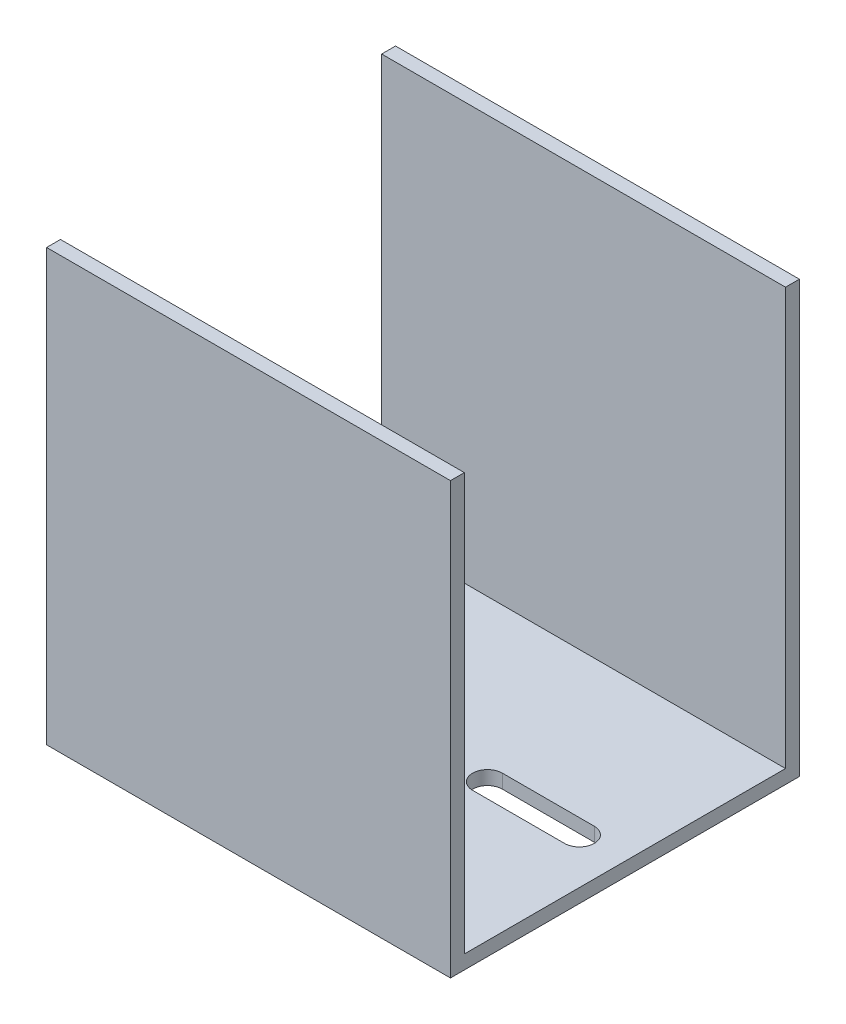
ISO-10303-21;
HEADER;
FILE_DESCRIPTION(('STEP AP214'),'2;1');
FILE_NAME('part.step','',(''),(''),'','','');
FILE_SCHEMA(('AUTOMOTIVE_DESIGN { 1 0 10303 214 1 1 1 1 }'));
ENDSEC;
DATA;
#1=APPLICATION_CONTEXT('core data for automotive mechanical design processes');
#2=APPLICATION_PROTOCOL_DEFINITION('international standard','automotive_design',2000,#1);
#3=PRODUCT_CONTEXT('',#1,'mechanical');
#4=PRODUCT('Part','Part','',(#3));
#5=PRODUCT_RELATED_PRODUCT_CATEGORY('part','',(#4));
#6=PRODUCT_DEFINITION_FORMATION('','',#4);
#7=PRODUCT_DEFINITION_CONTEXT('part definition',#1,'design');
#8=PRODUCT_DEFINITION('design','',#6,#7);
#9=PRODUCT_DEFINITION_SHAPE('','',#8);
#10=(LENGTH_UNIT() NAMED_UNIT(*) SI_UNIT(.MILLI.,.METRE.));
#11=(NAMED_UNIT(*) PLANE_ANGLE_UNIT() SI_UNIT($,.RADIAN.));
#12=(NAMED_UNIT(*) SI_UNIT($,.STERADIAN.) SOLID_ANGLE_UNIT());
#13=UNCERTAINTY_MEASURE_WITH_UNIT(LENGTH_MEASURE(1.E-05),#10,'distance_accuracy_value','');
#14=(GEOMETRIC_REPRESENTATION_CONTEXT(3) GLOBAL_UNCERTAINTY_ASSIGNED_CONTEXT((#13)) GLOBAL_UNIT_ASSIGNED_CONTEXT((#10,
#11,#12)) REPRESENTATION_CONTEXT('',''));
#15=CARTESIAN_POINT('',(0.,0.,0.));
#16=DIRECTION('',(0.,0.,1.));
#17=DIRECTION('',(1.,0.,0.));
#18=AXIS2_PLACEMENT_3D('',#15,#16,#17);
#19=CARTESIAN_POINT('',(0.,4.8,0.));
#20=DIRECTION('',(1.,0.,0.));
#21=DIRECTION('',(0.,0.,-1.));
#22=AXIS2_PLACEMENT_3D('',#19,#20,#21);
#23=PLANE('',#22);
#24=DIRECTION('',(0.,0.,1.));
#25=VECTOR('',#24,1.);
#26=CARTESIAN_POINT('',(0.,0.,0.));
#27=LINE('',#26,#25);
#28=CARTESIAN_POINT('',(0.,0.,0.));
#29=VERTEX_POINT('',#28);
#30=CARTESIAN_POINT('',(0.,0.,120.7));
#31=VERTEX_POINT('',#30);
#32=EDGE_CURVE('E225',#29,#31,#27,.T.);
#33=ORIENTED_EDGE('',*,*,#32,.T.);
#34=DIRECTION('',(0.,-1.,0.));
#35=VECTOR('',#34,1.);
#36=CARTESIAN_POINT('',(0.,149.,120.7));
#37=LINE('',#36,#35);
#38=CARTESIAN_POINT('',(0.,149.,120.7));
#39=VERTEX_POINT('',#38);
#40=EDGE_CURVE('E442',#39,#31,#37,.T.);
#41=ORIENTED_EDGE('',*,*,#40,.F.);
#42=DIRECTION('',(0.,0.,1.));
#43=VECTOR('',#42,1.);
#44=CARTESIAN_POINT('',(0.,149.,0.));
#45=LINE('',#44,#43);
#46=CARTESIAN_POINT('',(0.,149.,115.9));
#47=VERTEX_POINT('',#46);
#48=EDGE_CURVE('E426',#47,#39,#45,.T.);
#49=ORIENTED_EDGE('',*,*,#48,.F.);
#50=DIRECTION('',(0.,-1.,0.));
#51=VECTOR('',#50,1.);
#52=CARTESIAN_POINT('',(0.,149.,115.9));
#53=LINE('',#52,#51);
#54=CARTESIAN_POINT('',(0.,4.8,115.9));
#55=VERTEX_POINT('',#54);
#56=EDGE_CURVE('E189',#47,#55,#53,.T.);
#57=ORIENTED_EDGE('',*,*,#56,.T.);
#58=DIRECTION('',(0.,0.,1.));
#59=VECTOR('',#58,1.);
#60=CARTESIAN_POINT('',(0.,4.8,0.));
#61=LINE('',#60,#59);
#62=CARTESIAN_POINT('',(0.,4.8,4.8));
#63=VERTEX_POINT('',#62);
#64=EDGE_CURVE('E52',#63,#55,#61,.T.);
#65=ORIENTED_EDGE('',*,*,#64,.F.);
#66=DIRECTION('',(0.,-1.,0.));
#67=VECTOR('',#66,1.);
#68=CARTESIAN_POINT('',(0.,149.,4.8));
#69=LINE('',#68,#67);
#70=CARTESIAN_POINT('',(0.,149.,4.8));
#71=VERTEX_POINT('',#70);
#72=EDGE_CURVE('E417',#71,#63,#69,.T.);
#73=ORIENTED_EDGE('',*,*,#72,.F.);
#74=DIRECTION('',(0.,0.,1.));
#75=VECTOR('',#74,1.);
#76=CARTESIAN_POINT('',(0.,149.,0.));
#77=LINE('',#76,#75);
#78=CARTESIAN_POINT('',(0.,149.,0.));
#79=VERTEX_POINT('',#78);
#80=EDGE_CURVE('E409',#79,#71,#77,.T.);
#81=ORIENTED_EDGE('',*,*,#80,.F.);
#82=DIRECTION('',(0.,-1.,0.));
#83=VECTOR('',#82,1.);
#84=CARTESIAN_POINT('',(0.,149.,0.));
#85=LINE('',#84,#83);
#86=EDGE_CURVE('E407',#79,#29,#85,.T.);
#87=ORIENTED_EDGE('',*,*,#86,.T.);
#88=EDGE_LOOP('',(#33,#41,#49,#57,#65,#73,#81,#87));
#89=FACE_BOUND('',#88,.T.);
#90=ADVANCED_FACE('F33',(#89),#23,.F.);
#91=CARTESIAN_POINT('',(139.7,4.8,0.));
#92=DIRECTION('',(1.,0.,0.));
#93=DIRECTION('',(0.,0.,-1.));
#94=AXIS2_PLACEMENT_3D('',#91,#92,#93);
#95=PLANE('',#94);
#96=DIRECTION('',(0.,0.,1.));
#97=VECTOR('',#96,1.);
#98=CARTESIAN_POINT('',(139.7,0.,0.));
#99=LINE('',#98,#97);
#100=CARTESIAN_POINT('',(139.7,0.,0.));
#101=VERTEX_POINT('',#100);
#102=CARTESIAN_POINT('',(139.7,0.,120.7));
#103=VERTEX_POINT('',#102);
#104=EDGE_CURVE('E228',#101,#103,#99,.T.);
#105=ORIENTED_EDGE('',*,*,#104,.F.);
#106=DIRECTION('',(0.,-1.,0.));
#107=VECTOR('',#106,1.);
#108=CARTESIAN_POINT('',(139.7,149.,0.));
#109=LINE('',#108,#107);
#110=CARTESIAN_POINT('',(139.7,149.,0.));
#111=VERTEX_POINT('',#110);
#112=EDGE_CURVE('E404',#111,#101,#109,.T.);
#113=ORIENTED_EDGE('',*,*,#112,.F.);
#114=DIRECTION('',(0.,0.,1.));
#115=VECTOR('',#114,1.);
#116=CARTESIAN_POINT('',(139.7,149.,0.));
#117=LINE('',#116,#115);
#118=CARTESIAN_POINT('',(139.7,149.,4.8));
#119=VERTEX_POINT('',#118);
#120=EDGE_CURVE('E385',#111,#119,#117,.T.);
#121=ORIENTED_EDGE('',*,*,#120,.T.);
#122=DIRECTION('',(0.,-1.,0.));
#123=VECTOR('',#122,1.);
#124=CARTESIAN_POINT('',(139.7,149.,4.8));
#125=LINE('',#124,#123);
#126=CARTESIAN_POINT('',(139.7,4.8,4.8));
#127=VERTEX_POINT('',#126);
#128=EDGE_CURVE('E414',#119,#127,#125,.T.);
#129=ORIENTED_EDGE('',*,*,#128,.T.);
#130=DIRECTION('',(0.,0.,1.));
#131=VECTOR('',#130,1.);
#132=CARTESIAN_POINT('',(139.7,4.8,0.));
#133=LINE('',#132,#131);
#134=CARTESIAN_POINT('',(139.7,4.8,115.9));
#135=VERTEX_POINT('',#134);
#136=EDGE_CURVE('E178',#127,#135,#133,.T.);
#137=ORIENTED_EDGE('',*,*,#136,.T.);
#138=DIRECTION('',(0.,-1.,0.));
#139=VECTOR('',#138,1.);
#140=CARTESIAN_POINT('',(139.7,149.,115.9));
#141=LINE('',#140,#139);
#142=CARTESIAN_POINT('',(139.7,149.,115.9));
#143=VERTEX_POINT('',#142);
#144=EDGE_CURVE('E435',#143,#135,#141,.T.);
#145=ORIENTED_EDGE('',*,*,#144,.F.);
#146=DIRECTION('',(0.,0.,1.));
#147=VECTOR('',#146,1.);
#148=CARTESIAN_POINT('',(139.7,149.,0.));
#149=LINE('',#148,#147);
#150=CARTESIAN_POINT('',(139.7,149.,120.7));
#151=VERTEX_POINT('',#150);
#152=EDGE_CURVE('E432',#143,#151,#149,.T.);
#153=ORIENTED_EDGE('',*,*,#152,.T.);
#154=DIRECTION('',(0.,-1.,0.));
#155=VECTOR('',#154,1.);
#156=CARTESIAN_POINT('',(139.7,149.,120.7));
#157=LINE('',#156,#155);
#158=EDGE_CURVE('E439',#151,#103,#157,.T.);
#159=ORIENTED_EDGE('',*,*,#158,.T.);
#160=EDGE_LOOP('',(#105,#113,#121,#129,#137,#145,#153,#159));
#161=FACE_BOUND('',#160,.T.);
#162=ADVANCED_FACE('F309',(#161),#95,.T.);
#163=CARTESIAN_POINT('',(123.9,4.8,60.3));
#164=DIRECTION('',(0.,-1.,0.));
#165=DIRECTION('',(0.,0.,-1.));
#166=AXIS2_PLACEMENT_3D('',#163,#164,#165);
#167=CYLINDRICAL_SURFACE('',#166,5.14999999999998);
#168=CARTESIAN_POINT('',(123.9,0.,60.3));
#169=DIRECTION('',(0.,1.,0.));
#170=DIRECTION('',(0.,0.,1.));
#171=AXIS2_PLACEMENT_3D('',#168,#169,#170);
#172=CIRCLE('',#171,5.14999999999998);
#173=CARTESIAN_POINT('',(123.9,0.,65.45));
#174=VERTEX_POINT('',#173);
#175=CARTESIAN_POINT('',(123.9,0.,55.15));
#176=VERTEX_POINT('',#175);
#177=EDGE_CURVE('E210',#174,#176,#172,.T.);
#178=ORIENTED_EDGE('',*,*,#177,.F.);
#179=DIRECTION('',(0.,-1.,0.));
#180=VECTOR('',#179,1.);
#181=CARTESIAN_POINT('',(123.9,4.8,65.45));
#182=LINE('',#181,#180);
#183=CARTESIAN_POINT('',(123.9,4.8,65.45));
#184=VERTEX_POINT('',#183);
#185=EDGE_CURVE('E11',#184,#174,#182,.T.);
#186=ORIENTED_EDGE('',*,*,#185,.F.);
#187=CARTESIAN_POINT('',(123.9,4.8,60.3));
#188=DIRECTION('',(0.,1.,0.));
#189=DIRECTION('',(0.,0.,1.));
#190=AXIS2_PLACEMENT_3D('',#187,#188,#189);
#191=CIRCLE('',#190,5.14999999999998);
#192=CARTESIAN_POINT('',(123.9,4.8,55.15));
#193=VERTEX_POINT('',#192);
#194=EDGE_CURVE('E148',#184,#193,#191,.T.);
#195=ORIENTED_EDGE('',*,*,#194,.T.);
#196=DIRECTION('',(0.,-1.,0.));
#197=VECTOR('',#196,1.);
#198=CARTESIAN_POINT('',(123.9,4.8,55.15));
#199=LINE('',#198,#197);
#200=EDGE_CURVE('E102',#193,#176,#199,.T.);
#201=ORIENTED_EDGE('',*,*,#200,.T.);
#202=EDGE_LOOP('',(#178,#186,#195,#201));
#203=FACE_BOUND('',#202,.T.);
#204=ADVANCED_FACE('F159',(#203),#167,.F.);
#205=CARTESIAN_POINT('',(0.,4.8,65.45));
#206=DIRECTION('',(0.,0.,-1.));
#207=DIRECTION('',(-1.,0.,0.));
#208=AXIS2_PLACEMENT_3D('',#205,#206,#207);
#209=PLANE('',#208);
#210=DIRECTION('',(1.,0.,0.));
#211=VECTOR('',#210,1.);
#212=CARTESIAN_POINT('',(0.,0.,65.45));
#213=LINE('',#212,#211);
#214=CARTESIAN_POINT('',(92.1,0.,65.45));
#215=VERTEX_POINT('',#214);
#216=EDGE_CURVE('E212',#215,#174,#213,.T.);
#217=ORIENTED_EDGE('',*,*,#216,.F.);
#218=DIRECTION('',(0.,-1.,0.));
#219=VECTOR('',#218,1.);
#220=CARTESIAN_POINT('',(92.1,4.8,65.45));
#221=LINE('',#220,#219);
#222=CARTESIAN_POINT('',(92.1,4.8,65.45));
#223=VERTEX_POINT('',#222);
#224=EDGE_CURVE('E43',#223,#215,#221,.T.);
#225=ORIENTED_EDGE('',*,*,#224,.F.);
#226=DIRECTION('',(1.,0.,0.));
#227=VECTOR('',#226,1.);
#228=CARTESIAN_POINT('',(0.,4.8,65.45));
#229=LINE('',#228,#227);
#230=EDGE_CURVE('E160',#223,#184,#229,.T.);
#231=ORIENTED_EDGE('',*,*,#230,.T.);
#232=ORIENTED_EDGE('',*,*,#185,.T.);
#233=EDGE_LOOP('',(#217,#225,#231,#232));
#234=FACE_BOUND('',#233,.T.);
#235=ADVANCED_FACE('F304',(#234),#209,.T.);
#236=CARTESIAN_POINT('',(92.1,4.8,60.3));
#237=DIRECTION('',(0.,-1.,0.));
#238=DIRECTION('',(0.,0.,-1.));
#239=AXIS2_PLACEMENT_3D('',#236,#237,#238);
#240=CYLINDRICAL_SURFACE('',#239,5.15);
#241=CARTESIAN_POINT('',(92.1,0.,60.3));
#242=DIRECTION('',(0.,1.,0.));
#243=DIRECTION('',(0.,0.,1.));
#244=AXIS2_PLACEMENT_3D('',#241,#242,#243);
#245=CIRCLE('',#244,5.15);
#246=CARTESIAN_POINT('',(92.1,0.,55.15));
#247=VERTEX_POINT('',#246);
#248=EDGE_CURVE('E215',#247,#215,#245,.T.);
#249=ORIENTED_EDGE('',*,*,#248,.F.);
#250=DIRECTION('',(0.,-1.,0.));
#251=VECTOR('',#250,1.);
#252=CARTESIAN_POINT('',(92.1,4.8,55.15));
#253=LINE('',#252,#251);
#254=CARTESIAN_POINT('',(92.1,4.8,55.15));
#255=VERTEX_POINT('',#254);
#256=EDGE_CURVE('E94',#255,#247,#253,.T.);
#257=ORIENTED_EDGE('',*,*,#256,.F.);
#258=CARTESIAN_POINT('',(92.1,4.8,60.3));
#259=DIRECTION('',(0.,1.,0.));
#260=DIRECTION('',(0.,0.,1.));
#261=AXIS2_PLACEMENT_3D('',#258,#259,#260);
#262=CIRCLE('',#261,5.15);
#263=EDGE_CURVE('E151',#255,#223,#262,.T.);
#264=ORIENTED_EDGE('',*,*,#263,.T.);
#265=ORIENTED_EDGE('',*,*,#224,.T.);
#266=EDGE_LOOP('',(#249,#257,#264,#265));
#267=FACE_BOUND('',#266,.T.);
#268=ADVANCED_FACE('F297',(#267),#240,.F.);
#269=CARTESIAN_POINT('',(12.7,4.8,33.3));
#270=DIRECTION('',(0.,-1.,0.));
#271=DIRECTION('',(0.,0.,-1.));
#272=AXIS2_PLACEMENT_3D('',#269,#270,#271);
#273=CYLINDRICAL_SURFACE('',#272,5.15);
#274=CARTESIAN_POINT('',(12.7,0.,33.3));
#275=DIRECTION('',(0.,1.,0.));
#276=DIRECTION('',(0.,0.,1.));
#277=AXIS2_PLACEMENT_3D('',#274,#275,#276);
#278=CIRCLE('',#277,5.15);
#279=CARTESIAN_POINT('',(7.55000000000001,0.,33.3));
#280=VERTEX_POINT('',#279);
#281=CARTESIAN_POINT('',(17.85,0.,33.3));
#282=VERTEX_POINT('',#281);
#283=EDGE_CURVE('E198',#280,#282,#278,.T.);
#284=ORIENTED_EDGE('',*,*,#283,.F.);
#285=DIRECTION('',(0.,-1.,0.));
#286=VECTOR('',#285,1.);
#287=CARTESIAN_POINT('',(7.55000000000001,4.8,33.3));
#288=LINE('',#287,#286);
#289=CARTESIAN_POINT('',(7.55000000000001,4.8,33.3));
#290=VERTEX_POINT('',#289);
#291=EDGE_CURVE('E157',#290,#280,#288,.T.);
#292=ORIENTED_EDGE('',*,*,#291,.F.);
#293=CARTESIAN_POINT('',(12.7,4.8,33.3));
#294=DIRECTION('',(0.,1.,0.));
#295=DIRECTION('',(0.,0.,1.));
#296=AXIS2_PLACEMENT_3D('',#293,#294,#295);
#297=CIRCLE('',#296,5.15);
#298=CARTESIAN_POINT('',(17.85,4.8,33.3));
#299=VERTEX_POINT('',#298);
#300=EDGE_CURVE('E266',#290,#299,#297,.T.);
#301=ORIENTED_EDGE('',*,*,#300,.T.);
#302=DIRECTION('',(0.,-1.,0.));
#303=VECTOR('',#302,1.);
#304=CARTESIAN_POINT('',(17.85,4.8,33.3));
#305=LINE('',#304,#303);
#306=EDGE_CURVE('E234',#299,#282,#305,.T.);
#307=ORIENTED_EDGE('',*,*,#306,.T.);
#308=EDGE_LOOP('',(#284,#292,#301,#307));
#309=FACE_BOUND('',#308,.T.);
#310=ADVANCED_FACE('F295',(#309),#273,.F.);
#311=CARTESIAN_POINT('',(7.55,4.8,0.));
#312=DIRECTION('',(1.,0.,0.));
#313=DIRECTION('',(0.,0.,-1.));
#314=AXIS2_PLACEMENT_3D('',#311,#312,#313);
#315=PLANE('',#314);
#316=DIRECTION('',(0.,0.,1.));
#317=VECTOR('',#316,1.);
#318=CARTESIAN_POINT('',(7.55,0.,0.));
#319=LINE('',#318,#317);
#320=CARTESIAN_POINT('',(7.55000000000001,0.,20.6));
#321=VERTEX_POINT('',#320);
#322=EDGE_CURVE('E201',#321,#280,#319,.T.);
#323=ORIENTED_EDGE('',*,*,#322,.F.);
#324=DIRECTION('',(0.,-1.,0.));
#325=VECTOR('',#324,1.);
#326=CARTESIAN_POINT('',(7.55000000000001,4.8,20.6));
#327=LINE('',#326,#325);
#328=CARTESIAN_POINT('',(7.55000000000001,4.8,20.6));
#329=VERTEX_POINT('',#328);
#330=EDGE_CURVE('E238',#329,#321,#327,.T.);
#331=ORIENTED_EDGE('',*,*,#330,.F.);
#332=DIRECTION('',(0.,0.,1.));
#333=VECTOR('',#332,1.);
#334=CARTESIAN_POINT('',(7.55,4.8,0.));
#335=LINE('',#334,#333);
#336=EDGE_CURVE('E275',#329,#290,#335,.T.);
#337=ORIENTED_EDGE('',*,*,#336,.T.);
#338=ORIENTED_EDGE('',*,*,#291,.T.);
#339=EDGE_LOOP('',(#323,#331,#337,#338));
#340=FACE_BOUND('',#339,.T.);
#341=ADVANCED_FACE('F288',(#340),#315,.T.);
#342=CARTESIAN_POINT('',(12.7,4.8,20.6));
#343=DIRECTION('',(0.,-1.,0.));
#344=DIRECTION('',(0.,0.,-1.));
#345=AXIS2_PLACEMENT_3D('',#342,#343,#344);
#346=CYLINDRICAL_SURFACE('',#345,5.15);
#347=CARTESIAN_POINT('',(12.7,0.,20.6));
#348=DIRECTION('',(0.,1.,0.));
#349=DIRECTION('',(0.,0.,1.));
#350=AXIS2_PLACEMENT_3D('',#347,#348,#349);
#351=CIRCLE('',#350,5.15);
#352=CARTESIAN_POINT('',(17.85,0.,20.6));
#353=VERTEX_POINT('',#352);
#354=EDGE_CURVE('E204',#353,#321,#351,.T.);
#355=ORIENTED_EDGE('',*,*,#354,.F.);
#356=DIRECTION('',(0.,-1.,0.));
#357=VECTOR('',#356,1.);
#358=CARTESIAN_POINT('',(17.85,4.8,20.6));
#359=LINE('',#358,#357);
#360=CARTESIAN_POINT('',(17.85,4.8,20.6));
#361=VERTEX_POINT('',#360);
#362=EDGE_CURVE('E236',#361,#353,#359,.T.);
#363=ORIENTED_EDGE('',*,*,#362,.F.);
#364=CARTESIAN_POINT('',(12.7,4.8,20.6));
#365=DIRECTION('',(0.,1.,0.));
#366=DIRECTION('',(0.,0.,1.));
#367=AXIS2_PLACEMENT_3D('',#364,#365,#366);
#368=CIRCLE('',#367,5.15);
#369=EDGE_CURVE('E164',#361,#329,#368,.T.);
#370=ORIENTED_EDGE('',*,*,#369,.T.);
#371=ORIENTED_EDGE('',*,*,#330,.T.);
#372=EDGE_LOOP('',(#355,#363,#370,#371));
#373=FACE_BOUND('',#372,.T.);
#374=ADVANCED_FACE('F281',(#373),#346,.F.);
#375=CARTESIAN_POINT('',(12.7,4.8,100.));
#376=DIRECTION('',(0.,-1.,0.));
#377=DIRECTION('',(0.,0.,-1.));
#378=AXIS2_PLACEMENT_3D('',#375,#376,#377);
#379=CYLINDRICAL_SURFACE('',#378,5.15);
#380=CARTESIAN_POINT('',(12.7,0.,100.));
#381=DIRECTION('',(0.,1.,0.));
#382=DIRECTION('',(0.,0.,1.));
#383=AXIS2_PLACEMENT_3D('',#380,#381,#382);
#384=CIRCLE('',#383,5.15);
#385=CARTESIAN_POINT('',(7.55000000000001,0.,100.));
#386=VERTEX_POINT('',#385);
#387=CARTESIAN_POINT('',(17.85,0.,100.));
#388=VERTEX_POINT('',#387);
#389=EDGE_CURVE('E185',#386,#388,#384,.T.);
#390=ORIENTED_EDGE('',*,*,#389,.F.);
#391=DIRECTION('',(0.,-1.,0.));
#392=VECTOR('',#391,1.);
#393=CARTESIAN_POINT('',(7.55000000000001,4.8,100.));
#394=LINE('',#393,#392);
#395=CARTESIAN_POINT('',(7.55000000000001,4.8,100.));
#396=VERTEX_POINT('',#395);
#397=EDGE_CURVE('E37',#396,#386,#394,.T.);
#398=ORIENTED_EDGE('',*,*,#397,.F.);
#399=CARTESIAN_POINT('',(12.7,4.8,100.));
#400=DIRECTION('',(0.,1.,0.));
#401=DIRECTION('',(0.,0.,1.));
#402=AXIS2_PLACEMENT_3D('',#399,#400,#401);
#403=CIRCLE('',#402,5.15);
#404=CARTESIAN_POINT('',(17.85,4.8,100.));
#405=VERTEX_POINT('',#404);
#406=EDGE_CURVE('E230',#396,#405,#403,.T.);
#407=ORIENTED_EDGE('',*,*,#406,.T.);
#408=DIRECTION('',(0.,-1.,0.));
#409=VECTOR('',#408,1.);
#410=CARTESIAN_POINT('',(17.85,4.8,100.));
#411=LINE('',#410,#409);
#412=EDGE_CURVE('E184',#405,#388,#411,.T.);
#413=ORIENTED_EDGE('',*,*,#412,.T.);
#414=EDGE_LOOP('',(#390,#398,#407,#413));
#415=FACE_BOUND('',#414,.T.);
#416=ADVANCED_FACE('F35',(#415),#379,.F.);
#417=CARTESIAN_POINT('',(7.55,4.8,0.));
#418=DIRECTION('',(1.,0.,0.));
#419=DIRECTION('',(0.,0.,-1.));
#420=AXIS2_PLACEMENT_3D('',#417,#418,#419);
#421=PLANE('',#420);
#422=DIRECTION('',(0.,0.,1.));
#423=VECTOR('',#422,1.);
#424=CARTESIAN_POINT('',(7.55,0.,0.));
#425=LINE('',#424,#423);
#426=CARTESIAN_POINT('',(7.55000000000001,0.,87.3));
#427=VERTEX_POINT('',#426);
#428=EDGE_CURVE('E188',#427,#386,#425,.T.);
#429=ORIENTED_EDGE('',*,*,#428,.F.);
#430=DIRECTION('',(0.,-1.,0.));
#431=VECTOR('',#430,1.);
#432=CARTESIAN_POINT('',(7.55000000000001,4.8,87.3));
#433=LINE('',#432,#431);
#434=CARTESIAN_POINT('',(7.55000000000001,4.8,87.3));
#435=VERTEX_POINT('',#434);
#436=EDGE_CURVE('E243',#435,#427,#433,.T.);
#437=ORIENTED_EDGE('',*,*,#436,.F.);
#438=DIRECTION('',(0.,0.,1.));
#439=VECTOR('',#438,1.);
#440=CARTESIAN_POINT('',(7.55,4.8,0.));
#441=LINE('',#440,#439);
#442=EDGE_CURVE('E252',#435,#396,#441,.T.);
#443=ORIENTED_EDGE('',*,*,#442,.T.);
#444=ORIENTED_EDGE('',*,*,#397,.T.);
#445=EDGE_LOOP('',(#429,#437,#443,#444));
#446=FACE_BOUND('',#445,.T.);
#447=ADVANCED_FACE('F250',(#446),#421,.T.);
#448=CARTESIAN_POINT('',(12.7,4.8,87.3));
#449=DIRECTION('',(0.,-1.,0.));
#450=DIRECTION('',(0.,0.,-1.));
#451=AXIS2_PLACEMENT_3D('',#448,#449,#450);
#452=CYLINDRICAL_SURFACE('',#451,5.15);
#453=CARTESIAN_POINT('',(12.7,0.,87.3));
#454=DIRECTION('',(0.,1.,0.));
#455=DIRECTION('',(0.,0.,1.));
#456=AXIS2_PLACEMENT_3D('',#453,#454,#455);
#457=CIRCLE('',#456,5.15);
#458=CARTESIAN_POINT('',(17.85,0.,87.3));
#459=VERTEX_POINT('',#458);
#460=EDGE_CURVE('E192',#459,#427,#457,.T.);
#461=ORIENTED_EDGE('',*,*,#460,.F.);
#462=DIRECTION('',(0.,-1.,0.));
#463=VECTOR('',#462,1.);
#464=CARTESIAN_POINT('',(17.85,4.8,87.3));
#465=LINE('',#464,#463);
#466=CARTESIAN_POINT('',(17.85,4.8,87.3));
#467=VERTEX_POINT('',#466);
#468=EDGE_CURVE('E242',#467,#459,#465,.T.);
#469=ORIENTED_EDGE('',*,*,#468,.F.);
#470=CARTESIAN_POINT('',(12.7,4.8,87.3));
#471=DIRECTION('',(0.,1.,0.));
#472=DIRECTION('',(0.,0.,1.));
#473=AXIS2_PLACEMENT_3D('',#470,#471,#472);
#474=CIRCLE('',#473,5.15);
#475=EDGE_CURVE('E261',#467,#435,#474,.T.);
#476=ORIENTED_EDGE('',*,*,#475,.T.);
#477=ORIENTED_EDGE('',*,*,#436,.T.);
#478=EDGE_LOOP('',(#461,#469,#476,#477));
#479=FACE_BOUND('',#478,.T.);
#480=ADVANCED_FACE('F258',(#479),#452,.F.);
#481=CARTESIAN_POINT('',(12.7,4.8,60.3));
#482=DIRECTION('',(0.,-1.,0.));
#483=DIRECTION('',(0.,0.,-1.));
#484=AXIS2_PLACEMENT_3D('',#481,#482,#483);
#485=CYLINDRICAL_SURFACE('',#484,5.15);
#486=CARTESIAN_POINT('',(12.7,4.8,60.3));
#487=DIRECTION('',(0.,1.,0.));
#488=DIRECTION('',(0.,0.,1.));
#489=AXIS2_PLACEMENT_3D('',#486,#487,#488);
#490=CIRCLE('',#489,5.15);
#491=CARTESIAN_POINT('',(12.7,4.8,65.45));
#492=VERTEX_POINT('',#491);
#493=EDGE_CURVE('E171',#492,#492,#490,.T.);
#494=ORIENTED_EDGE('',*,*,#493,.T.);
#495=EDGE_LOOP('',(#494));
#496=FACE_BOUND('',#495,.T.);
#497=CARTESIAN_POINT('',(12.7,0.,60.3));
#498=DIRECTION('',(0.,1.,0.));
#499=DIRECTION('',(0.,0.,1.));
#500=AXIS2_PLACEMENT_3D('',#497,#498,#499);
#501=CIRCLE('',#500,5.15);
#502=CARTESIAN_POINT('',(12.7,0.,65.45));
#503=VERTEX_POINT('',#502);
#504=EDGE_CURVE('E222',#503,#503,#501,.T.);
#505=ORIENTED_EDGE('',*,*,#504,.F.);
#506=EDGE_LOOP('',(#505));
#507=FACE_BOUND('',#506,.T.);
#508=ADVANCED_FACE('F318',(#496,#507),#485,.F.);
#509=CARTESIAN_POINT('',(39.7,4.8,60.3));
#510=DIRECTION('',(0.,-1.,0.));
#511=DIRECTION('',(0.,0.,-1.));
#512=AXIS2_PLACEMENT_3D('',#509,#510,#511);
#513=CYLINDRICAL_SURFACE('',#512,5.15);
#514=CARTESIAN_POINT('',(39.7,4.8,60.3));
#515=DIRECTION('',(0.,1.,0.));
#516=DIRECTION('',(0.,0.,1.));
#517=AXIS2_PLACEMENT_3D('',#514,#515,#516);
#518=CIRCLE('',#517,5.15);
#519=CARTESIAN_POINT('',(39.7,4.8,65.45));
#520=VERTEX_POINT('',#519);
#521=EDGE_CURVE('E152',#520,#520,#518,.T.);
#522=ORIENTED_EDGE('',*,*,#521,.T.);
#523=EDGE_LOOP('',(#522));
#524=FACE_BOUND('',#523,.T.);
#525=CARTESIAN_POINT('',(39.7,0.,60.3));
#526=DIRECTION('',(0.,1.,0.));
#527=DIRECTION('',(0.,0.,1.));
#528=AXIS2_PLACEMENT_3D('',#525,#526,#527);
#529=CIRCLE('',#528,5.15);
#530=CARTESIAN_POINT('',(39.7,0.,65.45));
#531=VERTEX_POINT('',#530);
#532=EDGE_CURVE('E219',#531,#531,#529,.T.);
#533=ORIENTED_EDGE('',*,*,#532,.F.);
#534=EDGE_LOOP('',(#533));
#535=FACE_BOUND('',#534,.T.);
#536=ADVANCED_FACE('F321',(#524,#535),#513,.F.);
#537=CARTESIAN_POINT('',(0.,4.8,55.15));
#538=DIRECTION('',(0.,0.,-1.));
#539=DIRECTION('',(-1.,0.,0.));
#540=AXIS2_PLACEMENT_3D('',#537,#538,#539);
#541=PLANE('',#540);
#542=DIRECTION('',(1.,0.,0.));
#543=VECTOR('',#542,1.);
#544=CARTESIAN_POINT('',(0.,0.,55.15));
#545=LINE('',#544,#543);
#546=EDGE_CURVE('E155',#247,#176,#545,.T.);
#547=ORIENTED_EDGE('',*,*,#546,.T.);
#548=ORIENTED_EDGE('',*,*,#200,.F.);
#549=DIRECTION('',(1.,0.,0.));
#550=VECTOR('',#549,1.);
#551=CARTESIAN_POINT('',(0.,4.8,55.15));
#552=LINE('',#551,#550);
#553=EDGE_CURVE('E144',#255,#193,#552,.T.);
#554=ORIENTED_EDGE('',*,*,#553,.F.);
#555=ORIENTED_EDGE('',*,*,#256,.T.);
#556=EDGE_LOOP('',(#547,#548,#554,#555));
#557=FACE_BOUND('',#556,.T.);
#558=ADVANCED_FACE('F154',(#557),#541,.F.);
#559=CARTESIAN_POINT('',(17.85,4.8,0.));
#560=DIRECTION('',(1.,0.,0.));
#561=DIRECTION('',(0.,0.,-1.));
#562=AXIS2_PLACEMENT_3D('',#559,#560,#561);
#563=PLANE('',#562);
#564=DIRECTION('',(0.,0.,1.));
#565=VECTOR('',#564,1.);
#566=CARTESIAN_POINT('',(17.85,0.,0.));
#567=LINE('',#566,#565);
#568=EDGE_CURVE('E207',#353,#282,#567,.T.);
#569=ORIENTED_EDGE('',*,*,#568,.T.);
#570=ORIENTED_EDGE('',*,*,#306,.F.);
#571=DIRECTION('',(0.,0.,1.));
#572=VECTOR('',#571,1.);
#573=CARTESIAN_POINT('',(17.85,4.8,0.));
#574=LINE('',#573,#572);
#575=EDGE_CURVE('E161',#361,#299,#574,.T.);
#576=ORIENTED_EDGE('',*,*,#575,.F.);
#577=ORIENTED_EDGE('',*,*,#362,.T.);
#578=EDGE_LOOP('',(#569,#570,#576,#577));
#579=FACE_BOUND('',#578,.T.);
#580=ADVANCED_FACE('F293',(#579),#563,.F.);
#581=CARTESIAN_POINT('',(17.85,4.8,0.));
#582=DIRECTION('',(1.,0.,0.));
#583=DIRECTION('',(0.,0.,-1.));
#584=AXIS2_PLACEMENT_3D('',#581,#582,#583);
#585=PLANE('',#584);
#586=DIRECTION('',(0.,0.,1.));
#587=VECTOR('',#586,1.);
#588=CARTESIAN_POINT('',(17.85,0.,0.));
#589=LINE('',#588,#587);
#590=EDGE_CURVE('E195',#459,#388,#589,.T.);
#591=ORIENTED_EDGE('',*,*,#590,.T.);
#592=ORIENTED_EDGE('',*,*,#412,.F.);
#593=DIRECTION('',(0.,0.,1.));
#594=VECTOR('',#593,1.);
#595=CARTESIAN_POINT('',(17.85,4.8,0.));
#596=LINE('',#595,#594);
#597=EDGE_CURVE('E263',#467,#405,#596,.T.);
#598=ORIENTED_EDGE('',*,*,#597,.F.);
#599=ORIENTED_EDGE('',*,*,#468,.T.);
#600=EDGE_LOOP('',(#591,#592,#598,#599));
#601=FACE_BOUND('',#600,.T.);
#602=ADVANCED_FACE('F264',(#601),#585,.F.);
#603=CARTESIAN_POINT('',(0.,4.8,0.));
#604=DIRECTION('',(0.,1.,0.));
#605=DIRECTION('',(0.,0.,1.));
#606=AXIS2_PLACEMENT_3D('',#603,#604,#605);
#607=PLANE('',#606);
#608=ORIENTED_EDGE('',*,*,#406,.F.);
#609=ORIENTED_EDGE('',*,*,#442,.F.);
#610=ORIENTED_EDGE('',*,*,#475,.F.);
#611=ORIENTED_EDGE('',*,*,#597,.T.);
#612=EDGE_LOOP('',(#608,#609,#610,#611));
#613=FACE_BOUND('',#612,.T.);
#614=ORIENTED_EDGE('',*,*,#300,.F.);
#615=ORIENTED_EDGE('',*,*,#336,.F.);
#616=ORIENTED_EDGE('',*,*,#369,.F.);
#617=ORIENTED_EDGE('',*,*,#575,.T.);
#618=EDGE_LOOP('',(#614,#615,#616,#617));
#619=FACE_BOUND('',#618,.T.);
#620=ORIENTED_EDGE('',*,*,#194,.F.);
#621=ORIENTED_EDGE('',*,*,#230,.F.);
#622=ORIENTED_EDGE('',*,*,#263,.F.);
#623=ORIENTED_EDGE('',*,*,#553,.T.);
#624=EDGE_LOOP('',(#620,#621,#622,#623));
#625=FACE_BOUND('',#624,.T.);
#626=ORIENTED_EDGE('',*,*,#521,.F.);
#627=EDGE_LOOP('',(#626));
#628=FACE_BOUND('',#627,.T.);
#629=ORIENTED_EDGE('',*,*,#493,.F.);
#630=EDGE_LOOP('',(#629));
#631=FACE_BOUND('',#630,.T.);
#632=ORIENTED_EDGE('',*,*,#64,.T.);
#633=DIRECTION('',(1.,0.,0.));
#634=VECTOR('',#633,1.);
#635=CARTESIAN_POINT('',(0.,4.8,115.9));
#636=LINE('',#635,#634);
#637=EDGE_CURVE('E175',#55,#135,#636,.T.);
#638=ORIENTED_EDGE('',*,*,#637,.T.);
#639=ORIENTED_EDGE('',*,*,#136,.F.);
#640=DIRECTION('',(1.,0.,0.));
#641=VECTOR('',#640,1.);
#642=CARTESIAN_POINT('',(0.,4.8,4.8));
#643=LINE('',#642,#641);
#644=EDGE_CURVE('E181',#63,#127,#643,.T.);
#645=ORIENTED_EDGE('',*,*,#644,.F.);
#646=EDGE_LOOP('',(#632,#638,#639,#645));
#647=FACE_BOUND('',#646,.T.);
#648=ADVANCED_FACE('F145',(#613,#619,#625,#628,#631,#647),#607,.T.);
#649=CARTESIAN_POINT('',(0.,0.,0.));
#650=DIRECTION('',(0.,1.,0.));
#651=DIRECTION('',(0.,0.,1.));
#652=AXIS2_PLACEMENT_3D('',#649,#650,#651);
#653=PLANE('',#652);
#654=ORIENTED_EDGE('',*,*,#389,.T.);
#655=ORIENTED_EDGE('',*,*,#590,.F.);
#656=ORIENTED_EDGE('',*,*,#460,.T.);
#657=ORIENTED_EDGE('',*,*,#428,.T.);
#658=EDGE_LOOP('',(#654,#655,#656,#657));
#659=FACE_BOUND('',#658,.T.);
#660=ORIENTED_EDGE('',*,*,#283,.T.);
#661=ORIENTED_EDGE('',*,*,#568,.F.);
#662=ORIENTED_EDGE('',*,*,#354,.T.);
#663=ORIENTED_EDGE('',*,*,#322,.T.);
#664=EDGE_LOOP('',(#660,#661,#662,#663));
#665=FACE_BOUND('',#664,.T.);
#666=ORIENTED_EDGE('',*,*,#177,.T.);
#667=ORIENTED_EDGE('',*,*,#546,.F.);
#668=ORIENTED_EDGE('',*,*,#248,.T.);
#669=ORIENTED_EDGE('',*,*,#216,.T.);
#670=EDGE_LOOP('',(#666,#667,#668,#669));
#671=FACE_BOUND('',#670,.T.);
#672=ORIENTED_EDGE('',*,*,#532,.T.);
#673=EDGE_LOOP('',(#672));
#674=FACE_BOUND('',#673,.T.);
#675=ORIENTED_EDGE('',*,*,#504,.T.);
#676=EDGE_LOOP('',(#675));
#677=FACE_BOUND('',#676,.T.);
#678=ORIENTED_EDGE('',*,*,#32,.F.);
#679=DIRECTION('',(1.,0.,0.));
#680=VECTOR('',#679,1.);
#681=CARTESIAN_POINT('',(0.,0.,0.));
#682=LINE('',#681,#680);
#683=EDGE_CURVE('E398',#29,#101,#682,.T.);
#684=ORIENTED_EDGE('',*,*,#683,.T.);
#685=ORIENTED_EDGE('',*,*,#104,.T.);
#686=DIRECTION('',(1.,0.,0.));
#687=VECTOR('',#686,1.);
#688=CARTESIAN_POINT('',(0.,0.,120.7));
#689=LINE('',#688,#687);
#690=EDGE_CURVE('E422',#31,#103,#689,.T.);
#691=ORIENTED_EDGE('',*,*,#690,.F.);
#692=EDGE_LOOP('',(#678,#684,#685,#691));
#693=FACE_BOUND('',#692,.T.);
#694=ADVANCED_FACE('F256',(#659,#665,#671,#674,#677,#693),#653,.F.);
#695=CARTESIAN_POINT('',(0.,149.,115.9));
#696=DIRECTION('',(0.,0.,-1.));
#697=DIRECTION('',(-1.,0.,0.));
#698=AXIS2_PLACEMENT_3D('',#695,#696,#697);
#699=PLANE('',#698);
#700=ORIENTED_EDGE('',*,*,#637,.F.);
#701=ORIENTED_EDGE('',*,*,#56,.F.);
#702=DIRECTION('',(1.,0.,0.));
#703=VECTOR('',#702,1.);
#704=CARTESIAN_POINT('',(0.,149.,115.9));
#705=LINE('',#704,#703);
#706=EDGE_CURVE('E423',#47,#143,#705,.T.);
#707=ORIENTED_EDGE('',*,*,#706,.T.);
#708=ORIENTED_EDGE('',*,*,#144,.T.);
#709=EDGE_LOOP('',(#700,#701,#707,#708));
#710=FACE_BOUND('',#709,.T.);
#711=ADVANCED_FACE('F354',(#710),#699,.T.);
#712=CARTESIAN_POINT('',(0.,149.,120.7));
#713=DIRECTION('',(0.,0.,-1.));
#714=DIRECTION('',(-1.,0.,0.));
#715=AXIS2_PLACEMENT_3D('',#712,#713,#714);
#716=PLANE('',#715);
#717=ORIENTED_EDGE('',*,*,#690,.T.);
#718=ORIENTED_EDGE('',*,*,#158,.F.);
#719=DIRECTION('',(1.,0.,0.));
#720=VECTOR('',#719,1.);
#721=CARTESIAN_POINT('',(0.,149.,120.7));
#722=LINE('',#721,#720);
#723=EDGE_CURVE('E429',#39,#151,#722,.T.);
#724=ORIENTED_EDGE('',*,*,#723,.F.);
#725=ORIENTED_EDGE('',*,*,#40,.T.);
#726=EDGE_LOOP('',(#717,#718,#724,#725));
#727=FACE_BOUND('',#726,.T.);
#728=ADVANCED_FACE('F358',(#727),#716,.F.);
#729=CARTESIAN_POINT('',(0.,149.,0.));
#730=DIRECTION('',(0.,1.,0.));
#731=DIRECTION('',(0.,0.,1.));
#732=AXIS2_PLACEMENT_3D('',#729,#730,#731);
#733=PLANE('',#732);
#734=ORIENTED_EDGE('',*,*,#706,.F.);
#735=ORIENTED_EDGE('',*,*,#48,.T.);
#736=ORIENTED_EDGE('',*,*,#723,.T.);
#737=ORIENTED_EDGE('',*,*,#152,.F.);
#738=EDGE_LOOP('',(#734,#735,#736,#737));
#739=FACE_BOUND('',#738,.T.);
#740=ADVANCED_FACE('F362',(#739),#733,.T.);
#741=CARTESIAN_POINT('',(0.,149.,4.8));
#742=DIRECTION('',(0.,0.,-1.));
#743=DIRECTION('',(-1.,0.,0.));
#744=AXIS2_PLACEMENT_3D('',#741,#742,#743);
#745=PLANE('',#744);
#746=ORIENTED_EDGE('',*,*,#72,.T.);
#747=ORIENTED_EDGE('',*,*,#644,.T.);
#748=ORIENTED_EDGE('',*,*,#128,.F.);
#749=DIRECTION('',(1.,0.,0.));
#750=VECTOR('',#749,1.);
#751=CARTESIAN_POINT('',(0.,149.,4.8));
#752=LINE('',#751,#750);
#753=EDGE_CURVE('E392',#71,#119,#752,.T.);
#754=ORIENTED_EDGE('',*,*,#753,.F.);
#755=EDGE_LOOP('',(#746,#747,#748,#754));
#756=FACE_BOUND('',#755,.T.);
#757=ADVANCED_FACE('F366',(#756),#745,.F.);
#758=CARTESIAN_POINT('',(0.,149.,0.));
#759=DIRECTION('',(0.,0.,-1.));
#760=DIRECTION('',(-1.,0.,0.));
#761=AXIS2_PLACEMENT_3D('',#758,#759,#760);
#762=PLANE('',#761);
#763=ORIENTED_EDGE('',*,*,#683,.F.);
#764=ORIENTED_EDGE('',*,*,#86,.F.);
#765=DIRECTION('',(1.,0.,0.));
#766=VECTOR('',#765,1.);
#767=CARTESIAN_POINT('',(0.,149.,0.));
#768=LINE('',#767,#766);
#769=EDGE_CURVE('E389',#79,#111,#768,.T.);
#770=ORIENTED_EDGE('',*,*,#769,.T.);
#771=ORIENTED_EDGE('',*,*,#112,.T.);
#772=EDGE_LOOP('',(#763,#764,#770,#771));
#773=FACE_BOUND('',#772,.T.);
#774=ADVANCED_FACE('F368',(#773),#762,.T.);
#775=CARTESIAN_POINT('',(0.,149.,0.));
#776=DIRECTION('',(0.,1.,0.));
#777=DIRECTION('',(0.,0.,1.));
#778=AXIS2_PLACEMENT_3D('',#775,#776,#777);
#779=PLANE('',#778);
#780=ORIENTED_EDGE('',*,*,#120,.F.);
#781=ORIENTED_EDGE('',*,*,#769,.F.);
#782=ORIENTED_EDGE('',*,*,#80,.T.);
#783=ORIENTED_EDGE('',*,*,#753,.T.);
#784=EDGE_LOOP('',(#780,#781,#782,#783));
#785=FACE_BOUND('',#784,.T.);
#786=ADVANCED_FACE('F371',(#785),#779,.T.);
#787=CLOSED_SHELL('',(#90,#162,#204,#235,#268,#310,#341,#374,#416,#447,#480,#508,#536,#558,#580,
#602,#648,#694,#711,#728,#740,#757,#774,#786));
#788=MANIFOLD_SOLID_BREP('B2',#787);
#789=ADVANCED_BREP_SHAPE_REPRESENTATION('',(#18,#788),#14);
#790=SHAPE_DEFINITION_REPRESENTATION(#9,#789);
ENDSEC;
END-ISO-10303-21;
